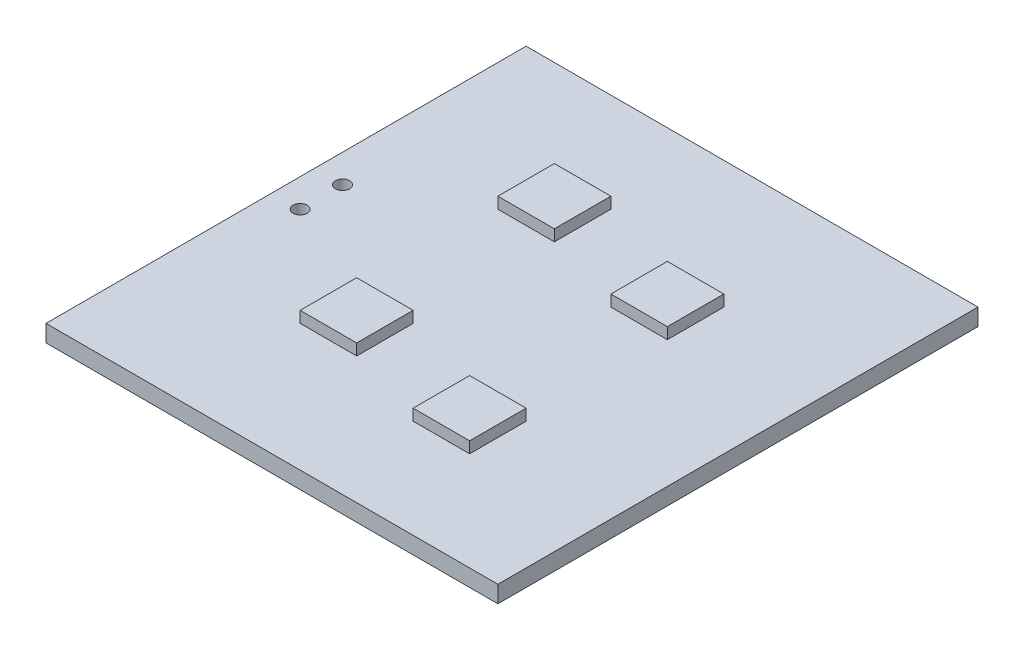
ISO-10303-21;
HEADER;
FILE_DESCRIPTION(('STEP AP214'),'2;1');
FILE_NAME('part.step','',(''),(''),'','','');
FILE_SCHEMA(('AUTOMOTIVE_DESIGN { 1 0 10303 214 1 1 1 1 }'));
ENDSEC;
DATA;
#1=APPLICATION_CONTEXT('core data for automotive mechanical design processes');
#2=APPLICATION_PROTOCOL_DEFINITION('international standard','automotive_design',2000,#1);
#3=PRODUCT_CONTEXT('',#1,'mechanical');
#4=PRODUCT('Part','Part','',(#3));
#5=PRODUCT_RELATED_PRODUCT_CATEGORY('part','',(#4));
#6=PRODUCT_DEFINITION_FORMATION('','',#4);
#7=PRODUCT_DEFINITION_CONTEXT('part definition',#1,'design');
#8=PRODUCT_DEFINITION('design','',#6,#7);
#9=PRODUCT_DEFINITION_SHAPE('','',#8);
#10=(LENGTH_UNIT() NAMED_UNIT(*) SI_UNIT(.MILLI.,.METRE.));
#11=(NAMED_UNIT(*) PLANE_ANGLE_UNIT() SI_UNIT($,.RADIAN.));
#12=(NAMED_UNIT(*) SI_UNIT($,.STERADIAN.) SOLID_ANGLE_UNIT());
#13=UNCERTAINTY_MEASURE_WITH_UNIT(LENGTH_MEASURE(1.E-05),#10,'distance_accuracy_value','');
#14=(GEOMETRIC_REPRESENTATION_CONTEXT(3) GLOBAL_UNCERTAINTY_ASSIGNED_CONTEXT((#13)) GLOBAL_UNIT_ASSIGNED_CONTEXT((#10,
#11,#12)) REPRESENTATION_CONTEXT('',''));
#15=CARTESIAN_POINT('',(0.,0.,0.));
#16=DIRECTION('',(0.,0.,1.));
#17=DIRECTION('',(1.,0.,0.));
#18=AXIS2_PLACEMENT_3D('',#15,#16,#17);
#19=CARTESIAN_POINT('',(0.,1.524,0.));
#20=DIRECTION('',(0.,-1.,0.));
#21=DIRECTION('',(0.,0.,-1.));
#22=AXIS2_PLACEMENT_3D('',#19,#20,#21);
#23=PLANE('',#22);
#24=DIRECTION('',(0.,0.,1.));
#25=VECTOR('',#24,1.);
#26=CARTESIAN_POINT('',(11.43,1.524,-16.51));
#27=LINE('',#26,#25);
#28=CARTESIAN_POINT('',(11.43,1.524,-16.51));
#29=VERTEX_POINT('',#28);
#30=CARTESIAN_POINT('',(11.43,1.524,-11.43));
#31=VERTEX_POINT('',#30);
#32=EDGE_CURVE('E193',#29,#31,#27,.T.);
#33=ORIENTED_EDGE('',*,*,#32,.F.);
#34=DIRECTION('',(-1.,0.,0.));
#35=VECTOR('',#34,1.);
#36=CARTESIAN_POINT('',(11.43,1.524,-16.51));
#37=LINE('',#36,#35);
#38=CARTESIAN_POINT('',(16.51,1.524,-16.51));
#39=VERTEX_POINT('',#38);
#40=EDGE_CURVE('E206',#39,#29,#37,.T.);
#41=ORIENTED_EDGE('',*,*,#40,.F.);
#42=DIRECTION('',(0.,0.,-1.));
#43=VECTOR('',#42,1.);
#44=CARTESIAN_POINT('',(16.51,1.524,-16.51));
#45=LINE('',#44,#43);
#46=CARTESIAN_POINT('',(16.51,1.524,-11.43));
#47=VERTEX_POINT('',#46);
#48=EDGE_CURVE('E215',#47,#39,#45,.T.);
#49=ORIENTED_EDGE('',*,*,#48,.F.);
#50=DIRECTION('',(1.,0.,0.));
#51=VECTOR('',#50,1.);
#52=CARTESIAN_POINT('',(11.43,1.524,-11.43));
#53=LINE('',#52,#51);
#54=EDGE_CURVE('E196',#31,#47,#53,.T.);
#55=ORIENTED_EDGE('',*,*,#54,.F.);
#56=EDGE_LOOP('',(#33,#41,#49,#55));
#57=FACE_BOUND('',#56,.T.);
#58=DIRECTION('',(0.,0.,1.));
#59=VECTOR('',#58,1.);
#60=CARTESIAN_POINT('',(11.43,1.524,-34.29));
#61=LINE('',#60,#59);
#62=CARTESIAN_POINT('',(11.43,1.524,-34.29));
#63=VERTEX_POINT('',#62);
#64=CARTESIAN_POINT('',(11.43,1.524,-29.21));
#65=VERTEX_POINT('',#64);
#66=EDGE_CURVE('E264',#63,#65,#61,.T.);
#67=ORIENTED_EDGE('',*,*,#66,.F.);
#68=DIRECTION('',(-1.,0.,0.));
#69=VECTOR('',#68,1.);
#70=CARTESIAN_POINT('',(11.43,1.524,-34.29));
#71=LINE('',#70,#69);
#72=CARTESIAN_POINT('',(16.51,1.524,-34.29));
#73=VERTEX_POINT('',#72);
#74=EDGE_CURVE('E269',#73,#63,#71,.T.);
#75=ORIENTED_EDGE('',*,*,#74,.F.);
#76=DIRECTION('',(0.,0.,-1.));
#77=VECTOR('',#76,1.);
#78=CARTESIAN_POINT('',(16.51,1.524,-34.29));
#79=LINE('',#78,#77);
#80=CARTESIAN_POINT('',(16.51,1.524,-29.21));
#81=VERTEX_POINT('',#80);
#82=EDGE_CURVE('E281',#81,#73,#79,.T.);
#83=ORIENTED_EDGE('',*,*,#82,.F.);
#84=DIRECTION('',(1.,0.,0.));
#85=VECTOR('',#84,1.);
#86=CARTESIAN_POINT('',(11.43,1.524,-29.21));
#87=LINE('',#86,#85);
#88=EDGE_CURVE('E278',#65,#81,#87,.T.);
#89=ORIENTED_EDGE('',*,*,#88,.F.);
#90=EDGE_LOOP('',(#67,#75,#83,#89));
#91=FACE_BOUND('',#90,.T.);
#92=CARTESIAN_POINT('',(2.54,1.524,-24.13));
#93=DIRECTION('',(0.,1.,0.));
#94=DIRECTION('',(0.,0.,1.));
#95=AXIS2_PLACEMENT_3D('',#92,#93,#94);
#96=CIRCLE('',#95,0.634999999999998);
#97=CARTESIAN_POINT('',(2.54,1.524,-23.495));
#98=VERTEX_POINT('',#97);
#99=EDGE_CURVE('E302',#98,#98,#96,.T.);
#100=ORIENTED_EDGE('',*,*,#99,.F.);
#101=EDGE_LOOP('',(#100));
#102=FACE_BOUND('',#101,.T.);
#103=CARTESIAN_POINT('',(2.54,1.524,-20.32));
#104=DIRECTION('',(0.,1.,0.));
#105=DIRECTION('',(0.,0.,1.));
#106=AXIS2_PLACEMENT_3D('',#103,#104,#105);
#107=CIRCLE('',#106,0.634999999999999);
#108=CARTESIAN_POINT('',(2.54,1.524,-19.685));
#109=VERTEX_POINT('',#108);
#110=EDGE_CURVE('E297',#109,#109,#107,.T.);
#111=ORIENTED_EDGE('',*,*,#110,.F.);
#112=EDGE_LOOP('',(#111));
#113=FACE_BOUND('',#112,.T.);
#114=DIRECTION('',(0.,0.,1.));
#115=VECTOR('',#114,1.);
#116=CARTESIAN_POINT('',(0.,1.524,0.));
#117=LINE('',#116,#115);
#118=CARTESIAN_POINT('',(0.,1.524,-43.18));
#119=VERTEX_POINT('',#118);
#120=CARTESIAN_POINT('',(0.,1.524,0.));
#121=VERTEX_POINT('',#120);
#122=EDGE_CURVE('E310',#119,#121,#117,.T.);
#123=ORIENTED_EDGE('',*,*,#122,.T.);
#124=DIRECTION('',(1.,0.,0.));
#125=VECTOR('',#124,1.);
#126=CARTESIAN_POINT('',(0.,1.524,0.));
#127=LINE('',#126,#125);
#128=CARTESIAN_POINT('',(40.64,1.524,0.));
#129=VERTEX_POINT('',#128);
#130=EDGE_CURVE('E313',#121,#129,#127,.T.);
#131=ORIENTED_EDGE('',*,*,#130,.T.);
#132=DIRECTION('',(0.,0.,-1.));
#133=VECTOR('',#132,1.);
#134=CARTESIAN_POINT('',(40.64,1.524,0.));
#135=LINE('',#134,#133);
#136=CARTESIAN_POINT('',(40.64,1.524,-43.18));
#137=VERTEX_POINT('',#136);
#138=EDGE_CURVE('E316',#129,#137,#135,.T.);
#139=ORIENTED_EDGE('',*,*,#138,.T.);
#140=DIRECTION('',(-1.,0.,0.));
#141=VECTOR('',#140,1.);
#142=CARTESIAN_POINT('',(0.,1.524,-43.18));
#143=LINE('',#142,#141);
#144=EDGE_CURVE('E318',#137,#119,#143,.T.);
#145=ORIENTED_EDGE('',*,*,#144,.T.);
#146=EDGE_LOOP('',(#123,#131,#139,#145));
#147=FACE_BOUND('',#146,.T.);
#148=DIRECTION('',(0.,0.,1.));
#149=VECTOR('',#148,1.);
#150=CARTESIAN_POINT('',(24.13,1.524,-31.75));
#151=LINE('',#150,#149);
#152=CARTESIAN_POINT('',(24.13,1.524,-31.75));
#153=VERTEX_POINT('',#152);
#154=CARTESIAN_POINT('',(24.13,1.524,-26.67));
#155=VERTEX_POINT('',#154);
#156=EDGE_CURVE('E231',#153,#155,#151,.T.);
#157=ORIENTED_EDGE('',*,*,#156,.F.);
#158=DIRECTION('',(-1.,0.,0.));
#159=VECTOR('',#158,1.);
#160=CARTESIAN_POINT('',(24.13,1.524,-31.75));
#161=LINE('',#160,#159);
#162=CARTESIAN_POINT('',(29.21,1.524,-31.75));
#163=VERTEX_POINT('',#162);
#164=EDGE_CURVE('E236',#163,#153,#161,.T.);
#165=ORIENTED_EDGE('',*,*,#164,.F.);
#166=DIRECTION('',(0.,0.,-1.));
#167=VECTOR('',#166,1.);
#168=CARTESIAN_POINT('',(29.21,1.524,-31.75));
#169=LINE('',#168,#167);
#170=CARTESIAN_POINT('',(29.21,1.524,-26.67));
#171=VERTEX_POINT('',#170);
#172=EDGE_CURVE('E248',#171,#163,#169,.T.);
#173=ORIENTED_EDGE('',*,*,#172,.F.);
#174=DIRECTION('',(1.,0.,0.));
#175=VECTOR('',#174,1.);
#176=CARTESIAN_POINT('',(24.13,1.524,-26.67));
#177=LINE('',#176,#175);
#178=EDGE_CURVE('E245',#155,#171,#177,.T.);
#179=ORIENTED_EDGE('',*,*,#178,.F.);
#180=EDGE_LOOP('',(#157,#165,#173,#179));
#181=FACE_BOUND('',#180,.T.);
#182=DIRECTION('',(0.,0.,1.));
#183=VECTOR('',#182,1.);
#184=CARTESIAN_POINT('',(24.13,1.524,-13.97));
#185=LINE('',#184,#183);
#186=CARTESIAN_POINT('',(24.13,1.524,-13.97));
#187=VERTEX_POINT('',#186);
#188=CARTESIAN_POINT('',(24.13,1.524,-8.89));
#189=VERTEX_POINT('',#188);
#190=EDGE_CURVE('E192',#187,#189,#185,.T.);
#191=ORIENTED_EDGE('',*,*,#190,.F.);
#192=DIRECTION('',(-1.,0.,0.));
#193=VECTOR('',#192,1.);
#194=CARTESIAN_POINT('',(24.13,1.524,-13.97));
#195=LINE('',#194,#193);
#196=CARTESIAN_POINT('',(29.21,1.524,-13.97));
#197=VERTEX_POINT('',#196);
#198=EDGE_CURVE('E189',#197,#187,#195,.T.);
#199=ORIENTED_EDGE('',*,*,#198,.F.);
#200=DIRECTION('',(0.,0.,-1.));
#201=VECTOR('',#200,1.);
#202=CARTESIAN_POINT('',(29.21,1.524,-13.97));
#203=LINE('',#202,#201);
#204=CARTESIAN_POINT('',(29.21,1.524,-8.89));
#205=VERTEX_POINT('',#204);
#206=EDGE_CURVE('E55',#205,#197,#203,.T.);
#207=ORIENTED_EDGE('',*,*,#206,.F.);
#208=DIRECTION('',(1.,0.,0.));
#209=VECTOR('',#208,1.);
#210=CARTESIAN_POINT('',(24.13,1.524,-8.89));
#211=LINE('',#210,#209);
#212=EDGE_CURVE('E50',#189,#205,#211,.T.);
#213=ORIENTED_EDGE('',*,*,#212,.F.);
#214=EDGE_LOOP('',(#191,#199,#207,#213));
#215=FACE_BOUND('',#214,.T.);
#216=ADVANCED_FACE('F35',(#57,#91,#102,#113,#147,#181,#215),#23,.F.);
#217=CARTESIAN_POINT('',(0.,1.524,0.));
#218=DIRECTION('',(1.,0.,0.));
#219=DIRECTION('',(0.,0.,-1.));
#220=AXIS2_PLACEMENT_3D('',#217,#218,#219);
#221=PLANE('',#220);
#222=DIRECTION('',(0.,0.,1.));
#223=VECTOR('',#222,1.);
#224=CARTESIAN_POINT('',(0.,0.,0.));
#225=LINE('',#224,#223);
#226=CARTESIAN_POINT('',(0.,0.,-43.18));
#227=VERTEX_POINT('',#226);
#228=CARTESIAN_POINT('',(0.,0.,0.));
#229=VERTEX_POINT('',#228);
#230=EDGE_CURVE('E301',#227,#229,#225,.T.);
#231=ORIENTED_EDGE('',*,*,#230,.T.);
#232=DIRECTION('',(0.,-1.,0.));
#233=VECTOR('',#232,1.);
#234=CARTESIAN_POINT('',(0.,1.524,0.));
#235=LINE('',#234,#233);
#236=EDGE_CURVE('E11',#121,#229,#235,.T.);
#237=ORIENTED_EDGE('',*,*,#236,.F.);
#238=ORIENTED_EDGE('',*,*,#122,.F.);
#239=DIRECTION('',(0.,-1.,0.));
#240=VECTOR('',#239,1.);
#241=CARTESIAN_POINT('',(0.,1.524,-43.18));
#242=LINE('',#241,#240);
#243=EDGE_CURVE('E320',#119,#227,#242,.T.);
#244=ORIENTED_EDGE('',*,*,#243,.T.);
#245=EDGE_LOOP('',(#231,#237,#238,#244));
#246=FACE_BOUND('',#245,.T.);
#247=ADVANCED_FACE('F37',(#246),#221,.F.);
#248=CARTESIAN_POINT('',(0.,1.524,0.));
#249=DIRECTION('',(0.,0.,-1.));
#250=DIRECTION('',(-1.,0.,0.));
#251=AXIS2_PLACEMENT_3D('',#248,#249,#250);
#252=PLANE('',#251);
#253=DIRECTION('',(1.,0.,0.));
#254=VECTOR('',#253,1.);
#255=CARTESIAN_POINT('',(0.,0.,0.));
#256=LINE('',#255,#254);
#257=CARTESIAN_POINT('',(40.64,0.,0.));
#258=VERTEX_POINT('',#257);
#259=EDGE_CURVE('E323',#229,#258,#256,.T.);
#260=ORIENTED_EDGE('',*,*,#259,.T.);
#261=DIRECTION('',(0.,-1.,0.));
#262=VECTOR('',#261,1.);
#263=CARTESIAN_POINT('',(40.64,1.524,0.));
#264=LINE('',#263,#262);
#265=EDGE_CURVE('E43',#129,#258,#264,.T.);
#266=ORIENTED_EDGE('',*,*,#265,.F.);
#267=ORIENTED_EDGE('',*,*,#130,.F.);
#268=ORIENTED_EDGE('',*,*,#236,.T.);
#269=EDGE_LOOP('',(#260,#266,#267,#268));
#270=FACE_BOUND('',#269,.T.);
#271=ADVANCED_FACE('F353',(#270),#252,.F.);
#272=CARTESIAN_POINT('',(40.64,1.524,0.));
#273=DIRECTION('',(-1.,0.,0.));
#274=DIRECTION('',(0.,0.,1.));
#275=AXIS2_PLACEMENT_3D('',#272,#273,#274);
#276=PLANE('',#275);
#277=DIRECTION('',(0.,0.,-1.));
#278=VECTOR('',#277,1.);
#279=CARTESIAN_POINT('',(40.64,0.,0.));
#280=LINE('',#279,#278);
#281=CARTESIAN_POINT('',(40.64,0.,-43.18));
#282=VERTEX_POINT('',#281);
#283=EDGE_CURVE('E325',#258,#282,#280,.T.);
#284=ORIENTED_EDGE('',*,*,#283,.T.);
#285=DIRECTION('',(0.,-1.,0.));
#286=VECTOR('',#285,1.);
#287=CARTESIAN_POINT('',(40.64,1.524,-43.18));
#288=LINE('',#287,#286);
#289=EDGE_CURVE('E330',#137,#282,#288,.T.);
#290=ORIENTED_EDGE('',*,*,#289,.F.);
#291=ORIENTED_EDGE('',*,*,#138,.F.);
#292=ORIENTED_EDGE('',*,*,#265,.T.);
#293=EDGE_LOOP('',(#284,#290,#291,#292));
#294=FACE_BOUND('',#293,.T.);
#295=ADVANCED_FACE('F337',(#294),#276,.F.);
#296=CARTESIAN_POINT('',(0.,1.524,-43.18));
#297=DIRECTION('',(0.,0.,1.));
#298=DIRECTION('',(1.,0.,0.));
#299=AXIS2_PLACEMENT_3D('',#296,#297,#298);
#300=PLANE('',#299);
#301=DIRECTION('',(-1.,0.,0.));
#302=VECTOR('',#301,1.);
#303=CARTESIAN_POINT('',(0.,0.,-43.18));
#304=LINE('',#303,#302);
#305=EDGE_CURVE('E314',#282,#227,#304,.T.);
#306=ORIENTED_EDGE('',*,*,#305,.T.);
#307=ORIENTED_EDGE('',*,*,#243,.F.);
#308=ORIENTED_EDGE('',*,*,#144,.F.);
#309=ORIENTED_EDGE('',*,*,#289,.T.);
#310=EDGE_LOOP('',(#306,#307,#308,#309));
#311=FACE_BOUND('',#310,.T.);
#312=ADVANCED_FACE('F346',(#311),#300,.F.);
#313=CARTESIAN_POINT('',(0.,0.,0.));
#314=DIRECTION('',(0.,-1.,0.));
#315=DIRECTION('',(0.,0.,-1.));
#316=AXIS2_PLACEMENT_3D('',#313,#314,#315);
#317=PLANE('',#316);
#318=CARTESIAN_POINT('',(2.54,0.,-24.13));
#319=DIRECTION('',(0.,1.,0.));
#320=DIRECTION('',(0.,0.,1.));
#321=AXIS2_PLACEMENT_3D('',#318,#319,#320);
#322=CIRCLE('',#321,0.634999999999998);
#323=CARTESIAN_POINT('',(2.54,0.,-23.495));
#324=VERTEX_POINT('',#323);
#325=EDGE_CURVE('E298',#324,#324,#322,.T.);
#326=ORIENTED_EDGE('',*,*,#325,.T.);
#327=EDGE_LOOP('',(#326));
#328=FACE_BOUND('',#327,.T.);
#329=CARTESIAN_POINT('',(2.54,0.,-20.32));
#330=DIRECTION('',(0.,1.,0.));
#331=DIRECTION('',(0.,0.,1.));
#332=AXIS2_PLACEMENT_3D('',#329,#330,#331);
#333=CIRCLE('',#332,0.634999999999999);
#334=CARTESIAN_POINT('',(2.54,0.,-19.685));
#335=VERTEX_POINT('',#334);
#336=EDGE_CURVE('E305',#335,#335,#333,.T.);
#337=ORIENTED_EDGE('',*,*,#336,.T.);
#338=EDGE_LOOP('',(#337));
#339=FACE_BOUND('',#338,.T.);
#340=ORIENTED_EDGE('',*,*,#230,.F.);
#341=ORIENTED_EDGE('',*,*,#305,.F.);
#342=ORIENTED_EDGE('',*,*,#283,.F.);
#343=ORIENTED_EDGE('',*,*,#259,.F.);
#344=EDGE_LOOP('',(#340,#341,#342,#343));
#345=FACE_BOUND('',#344,.T.);
#346=ADVANCED_FACE('F343',(#328,#339,#345),#317,.T.);
#347=CARTESIAN_POINT('',(2.54,0.,-20.32));
#348=DIRECTION('',(0.,1.,0.));
#349=DIRECTION('',(0.,0.,1.));
#350=AXIS2_PLACEMENT_3D('',#347,#348,#349);
#351=CYLINDRICAL_SURFACE('',#350,0.634999999999999);
#352=ORIENTED_EDGE('',*,*,#336,.F.);
#353=EDGE_LOOP('',(#352));
#354=FACE_BOUND('',#353,.T.);
#355=ORIENTED_EDGE('',*,*,#110,.T.);
#356=EDGE_LOOP('',(#355));
#357=FACE_BOUND('',#356,.T.);
#358=ADVANCED_FACE('F368',(#354,#357),#351,.F.);
#359=CARTESIAN_POINT('',(2.54,0.,-24.13));
#360=DIRECTION('',(0.,1.,0.));
#361=DIRECTION('',(0.,0.,1.));
#362=AXIS2_PLACEMENT_3D('',#359,#360,#361);
#363=CYLINDRICAL_SURFACE('',#362,0.634999999999998);
#364=ORIENTED_EDGE('',*,*,#325,.F.);
#365=EDGE_LOOP('',(#364));
#366=FACE_BOUND('',#365,.T.);
#367=ORIENTED_EDGE('',*,*,#99,.T.);
#368=EDGE_LOOP('',(#367));
#369=FACE_BOUND('',#368,.T.);
#370=ADVANCED_FACE('F390',(#366,#369),#363,.F.);
#371=CARTESIAN_POINT('',(11.43,2.54,-34.29));
#372=DIRECTION('',(1.,0.,0.));
#373=DIRECTION('',(0.,0.,-1.));
#374=AXIS2_PLACEMENT_3D('',#371,#372,#373);
#375=PLANE('',#374);
#376=ORIENTED_EDGE('',*,*,#66,.T.);
#377=DIRECTION('',(0.,-1.,0.));
#378=VECTOR('',#377,1.);
#379=CARTESIAN_POINT('',(11.43,2.54,-29.21));
#380=LINE('',#379,#378);
#381=CARTESIAN_POINT('',(11.43,2.54,-29.21));
#382=VERTEX_POINT('',#381);
#383=EDGE_CURVE('E294',#382,#65,#380,.T.);
#384=ORIENTED_EDGE('',*,*,#383,.F.);
#385=DIRECTION('',(0.,0.,1.));
#386=VECTOR('',#385,1.);
#387=CARTESIAN_POINT('',(11.43,2.54,-34.29));
#388=LINE('',#387,#386);
#389=CARTESIAN_POINT('',(11.43,2.54,-34.29));
#390=VERTEX_POINT('',#389);
#391=EDGE_CURVE('E265',#390,#382,#388,.T.);
#392=ORIENTED_EDGE('',*,*,#391,.F.);
#393=DIRECTION('',(0.,-1.,0.));
#394=VECTOR('',#393,1.);
#395=CARTESIAN_POINT('',(11.43,2.54,-34.29));
#396=LINE('',#395,#394);
#397=EDGE_CURVE('E275',#390,#63,#396,.T.);
#398=ORIENTED_EDGE('',*,*,#397,.T.);
#399=EDGE_LOOP('',(#376,#384,#392,#398));
#400=FACE_BOUND('',#399,.T.);
#401=ADVANCED_FACE('F397',(#400),#375,.F.);
#402=CARTESIAN_POINT('',(11.43,2.54,-29.21));
#403=DIRECTION('',(0.,0.,-1.));
#404=DIRECTION('',(-1.,0.,0.));
#405=AXIS2_PLACEMENT_3D('',#402,#403,#404);
#406=PLANE('',#405);
#407=ORIENTED_EDGE('',*,*,#88,.T.);
#408=DIRECTION('',(0.,-1.,0.));
#409=VECTOR('',#408,1.);
#410=CARTESIAN_POINT('',(16.51,2.54,-29.21));
#411=LINE('',#410,#409);
#412=CARTESIAN_POINT('',(16.51,2.54,-29.21));
#413=VERTEX_POINT('',#412);
#414=EDGE_CURVE('E291',#413,#81,#411,.T.);
#415=ORIENTED_EDGE('',*,*,#414,.F.);
#416=DIRECTION('',(1.,0.,0.));
#417=VECTOR('',#416,1.);
#418=CARTESIAN_POINT('',(11.43,2.54,-29.21));
#419=LINE('',#418,#417);
#420=EDGE_CURVE('E268',#382,#413,#419,.T.);
#421=ORIENTED_EDGE('',*,*,#420,.F.);
#422=ORIENTED_EDGE('',*,*,#383,.T.);
#423=EDGE_LOOP('',(#407,#415,#421,#422));
#424=FACE_BOUND('',#423,.T.);
#425=ADVANCED_FACE('F404',(#424),#406,.F.);
#426=CARTESIAN_POINT('',(16.51,2.54,-34.29));
#427=DIRECTION('',(-1.,0.,0.));
#428=DIRECTION('',(0.,0.,1.));
#429=AXIS2_PLACEMENT_3D('',#426,#427,#428);
#430=PLANE('',#429);
#431=ORIENTED_EDGE('',*,*,#82,.T.);
#432=DIRECTION('',(0.,-1.,0.));
#433=VECTOR('',#432,1.);
#434=CARTESIAN_POINT('',(16.51,2.54,-34.29));
#435=LINE('',#434,#433);
#436=CARTESIAN_POINT('',(16.51,2.54,-34.29));
#437=VERTEX_POINT('',#436);
#438=EDGE_CURVE('E288',#437,#73,#435,.T.);
#439=ORIENTED_EDGE('',*,*,#438,.F.);
#440=DIRECTION('',(0.,0.,-1.));
#441=VECTOR('',#440,1.);
#442=CARTESIAN_POINT('',(16.51,2.54,-34.29));
#443=LINE('',#442,#441);
#444=EDGE_CURVE('E271',#413,#437,#443,.T.);
#445=ORIENTED_EDGE('',*,*,#444,.F.);
#446=ORIENTED_EDGE('',*,*,#414,.T.);
#447=EDGE_LOOP('',(#431,#439,#445,#446));
#448=FACE_BOUND('',#447,.T.);
#449=ADVANCED_FACE('F414',(#448),#430,.F.);
#450=CARTESIAN_POINT('',(11.43,2.54,-34.29));
#451=DIRECTION('',(0.,0.,1.));
#452=DIRECTION('',(1.,0.,0.));
#453=AXIS2_PLACEMENT_3D('',#450,#451,#452);
#454=PLANE('',#453);
#455=ORIENTED_EDGE('',*,*,#74,.T.);
#456=ORIENTED_EDGE('',*,*,#397,.F.);
#457=DIRECTION('',(-1.,0.,0.));
#458=VECTOR('',#457,1.);
#459=CARTESIAN_POINT('',(11.43,2.54,-34.29));
#460=LINE('',#459,#458);
#461=EDGE_CURVE('E273',#437,#390,#460,.T.);
#462=ORIENTED_EDGE('',*,*,#461,.F.);
#463=ORIENTED_EDGE('',*,*,#438,.T.);
#464=EDGE_LOOP('',(#455,#456,#462,#463));
#465=FACE_BOUND('',#464,.T.);
#466=ADVANCED_FACE('F423',(#465),#454,.F.);
#467=CARTESIAN_POINT('',(0.,2.54,0.));
#468=DIRECTION('',(0.,1.,0.));
#469=DIRECTION('',(0.,0.,1.));
#470=AXIS2_PLACEMENT_3D('',#467,#468,#469);
#471=PLANE('',#470);
#472=ORIENTED_EDGE('',*,*,#391,.T.);
#473=ORIENTED_EDGE('',*,*,#420,.T.);
#474=ORIENTED_EDGE('',*,*,#444,.T.);
#475=ORIENTED_EDGE('',*,*,#461,.T.);
#476=EDGE_LOOP('',(#472,#473,#474,#475));
#477=FACE_BOUND('',#476,.T.);
#478=ADVANCED_FACE('F431',(#477),#471,.T.);
#479=CARTESIAN_POINT('',(24.13,2.54,-31.75));
#480=DIRECTION('',(1.,0.,0.));
#481=DIRECTION('',(0.,0.,-1.));
#482=AXIS2_PLACEMENT_3D('',#479,#480,#481);
#483=PLANE('',#482);
#484=ORIENTED_EDGE('',*,*,#156,.T.);
#485=DIRECTION('',(0.,-1.,0.));
#486=VECTOR('',#485,1.);
#487=CARTESIAN_POINT('',(24.13,2.54,-26.67));
#488=LINE('',#487,#486);
#489=CARTESIAN_POINT('',(24.13,2.54,-26.67));
#490=VERTEX_POINT('',#489);
#491=EDGE_CURVE('E261',#490,#155,#488,.T.);
#492=ORIENTED_EDGE('',*,*,#491,.F.);
#493=DIRECTION('',(0.,0.,1.));
#494=VECTOR('',#493,1.);
#495=CARTESIAN_POINT('',(24.13,2.54,-31.75));
#496=LINE('',#495,#494);
#497=CARTESIAN_POINT('',(24.13,2.54,-31.75));
#498=VERTEX_POINT('',#497);
#499=EDGE_CURVE('E232',#498,#490,#496,.T.);
#500=ORIENTED_EDGE('',*,*,#499,.F.);
#501=DIRECTION('',(0.,-1.,0.));
#502=VECTOR('',#501,1.);
#503=CARTESIAN_POINT('',(24.13,2.54,-31.75));
#504=LINE('',#503,#502);
#505=EDGE_CURVE('E242',#498,#153,#504,.T.);
#506=ORIENTED_EDGE('',*,*,#505,.T.);
#507=EDGE_LOOP('',(#484,#492,#500,#506));
#508=FACE_BOUND('',#507,.T.);
#509=ADVANCED_FACE('F438',(#508),#483,.F.);
#510=CARTESIAN_POINT('',(24.13,2.54,-26.67));
#511=DIRECTION('',(0.,0.,-1.));
#512=DIRECTION('',(-1.,0.,0.));
#513=AXIS2_PLACEMENT_3D('',#510,#511,#512);
#514=PLANE('',#513);
#515=ORIENTED_EDGE('',*,*,#178,.T.);
#516=DIRECTION('',(0.,-1.,0.));
#517=VECTOR('',#516,1.);
#518=CARTESIAN_POINT('',(29.21,2.54,-26.67));
#519=LINE('',#518,#517);
#520=CARTESIAN_POINT('',(29.21,2.54,-26.67));
#521=VERTEX_POINT('',#520);
#522=EDGE_CURVE('E258',#521,#171,#519,.T.);
#523=ORIENTED_EDGE('',*,*,#522,.F.);
#524=DIRECTION('',(1.,0.,0.));
#525=VECTOR('',#524,1.);
#526=CARTESIAN_POINT('',(24.13,2.54,-26.67));
#527=LINE('',#526,#525);
#528=EDGE_CURVE('E235',#490,#521,#527,.T.);
#529=ORIENTED_EDGE('',*,*,#528,.F.);
#530=ORIENTED_EDGE('',*,*,#491,.T.);
#531=EDGE_LOOP('',(#515,#523,#529,#530));
#532=FACE_BOUND('',#531,.T.);
#533=ADVANCED_FACE('F446',(#532),#514,.F.);
#534=CARTESIAN_POINT('',(29.21,2.54,-31.75));
#535=DIRECTION('',(-1.,0.,0.));
#536=DIRECTION('',(0.,0.,1.));
#537=AXIS2_PLACEMENT_3D('',#534,#535,#536);
#538=PLANE('',#537);
#539=ORIENTED_EDGE('',*,*,#172,.T.);
#540=DIRECTION('',(0.,-1.,0.));
#541=VECTOR('',#540,1.);
#542=CARTESIAN_POINT('',(29.21,2.54,-31.75));
#543=LINE('',#542,#541);
#544=CARTESIAN_POINT('',(29.21,2.54,-31.75));
#545=VERTEX_POINT('',#544);
#546=EDGE_CURVE('E255',#545,#163,#543,.T.);
#547=ORIENTED_EDGE('',*,*,#546,.F.);
#548=DIRECTION('',(0.,0.,-1.));
#549=VECTOR('',#548,1.);
#550=CARTESIAN_POINT('',(29.21,2.54,-31.75));
#551=LINE('',#550,#549);
#552=EDGE_CURVE('E238',#521,#545,#551,.T.);
#553=ORIENTED_EDGE('',*,*,#552,.F.);
#554=ORIENTED_EDGE('',*,*,#522,.T.);
#555=EDGE_LOOP('',(#539,#547,#553,#554));
#556=FACE_BOUND('',#555,.T.);
#557=ADVANCED_FACE('F454',(#556),#538,.F.);
#558=CARTESIAN_POINT('',(24.13,2.54,-31.75));
#559=DIRECTION('',(0.,0.,1.));
#560=DIRECTION('',(1.,0.,0.));
#561=AXIS2_PLACEMENT_3D('',#558,#559,#560);
#562=PLANE('',#561);
#563=ORIENTED_EDGE('',*,*,#164,.T.);
#564=ORIENTED_EDGE('',*,*,#505,.F.);
#565=DIRECTION('',(-1.,0.,0.));
#566=VECTOR('',#565,1.);
#567=CARTESIAN_POINT('',(24.13,2.54,-31.75));
#568=LINE('',#567,#566);
#569=EDGE_CURVE('E240',#545,#498,#568,.T.);
#570=ORIENTED_EDGE('',*,*,#569,.F.);
#571=ORIENTED_EDGE('',*,*,#546,.T.);
#572=EDGE_LOOP('',(#563,#564,#570,#571));
#573=FACE_BOUND('',#572,.T.);
#574=ADVANCED_FACE('F463',(#573),#562,.F.);
#575=CARTESIAN_POINT('',(0.,2.54,0.));
#576=DIRECTION('',(0.,1.,0.));
#577=DIRECTION('',(0.,0.,1.));
#578=AXIS2_PLACEMENT_3D('',#575,#576,#577);
#579=PLANE('',#578);
#580=ORIENTED_EDGE('',*,*,#499,.T.);
#581=ORIENTED_EDGE('',*,*,#528,.T.);
#582=ORIENTED_EDGE('',*,*,#552,.T.);
#583=ORIENTED_EDGE('',*,*,#569,.T.);
#584=EDGE_LOOP('',(#580,#581,#582,#583));
#585=FACE_BOUND('',#584,.T.);
#586=ADVANCED_FACE('F471',(#585),#579,.T.);
#587=CARTESIAN_POINT('',(11.43,2.54,-16.51));
#588=DIRECTION('',(1.,0.,0.));
#589=DIRECTION('',(0.,0.,-1.));
#590=AXIS2_PLACEMENT_3D('',#587,#588,#589);
#591=PLANE('',#590);
#592=ORIENTED_EDGE('',*,*,#32,.T.);
#593=DIRECTION('',(0.,-1.,0.));
#594=VECTOR('',#593,1.);
#595=CARTESIAN_POINT('',(11.43,2.54,-11.43));
#596=LINE('',#595,#594);
#597=CARTESIAN_POINT('',(11.43,2.54,-11.43));
#598=VERTEX_POINT('',#597);
#599=EDGE_CURVE('E228',#598,#31,#596,.T.);
#600=ORIENTED_EDGE('',*,*,#599,.F.);
#601=DIRECTION('',(0.,0.,1.));
#602=VECTOR('',#601,1.);
#603=CARTESIAN_POINT('',(11.43,2.54,-16.51));
#604=LINE('',#603,#602);
#605=CARTESIAN_POINT('',(11.43,2.54,-16.51));
#606=VERTEX_POINT('',#605);
#607=EDGE_CURVE('E202',#606,#598,#604,.T.);
#608=ORIENTED_EDGE('',*,*,#607,.F.);
#609=DIRECTION('',(0.,-1.,0.));
#610=VECTOR('',#609,1.);
#611=CARTESIAN_POINT('',(11.43,2.54,-16.51));
#612=LINE('',#611,#610);
#613=EDGE_CURVE('E211',#606,#29,#612,.T.);
#614=ORIENTED_EDGE('',*,*,#613,.T.);
#615=EDGE_LOOP('',(#592,#600,#608,#614));
#616=FACE_BOUND('',#615,.T.);
#617=ADVANCED_FACE('F478',(#616),#591,.F.);
#618=CARTESIAN_POINT('',(11.43,2.54,-11.43));
#619=DIRECTION('',(0.,0.,-1.));
#620=DIRECTION('',(-1.,0.,0.));
#621=AXIS2_PLACEMENT_3D('',#618,#619,#620);
#622=PLANE('',#621);
#623=ORIENTED_EDGE('',*,*,#54,.T.);
#624=DIRECTION('',(0.,-1.,0.));
#625=VECTOR('',#624,1.);
#626=CARTESIAN_POINT('',(16.51,2.54,-11.43));
#627=LINE('',#626,#625);
#628=CARTESIAN_POINT('',(16.51,2.54,-11.43));
#629=VERTEX_POINT('',#628);
#630=EDGE_CURVE('E225',#629,#47,#627,.T.);
#631=ORIENTED_EDGE('',*,*,#630,.F.);
#632=DIRECTION('',(1.,0.,0.));
#633=VECTOR('',#632,1.);
#634=CARTESIAN_POINT('',(11.43,2.54,-11.43));
#635=LINE('',#634,#633);
#636=EDGE_CURVE('E205',#598,#629,#635,.T.);
#637=ORIENTED_EDGE('',*,*,#636,.F.);
#638=ORIENTED_EDGE('',*,*,#599,.T.);
#639=EDGE_LOOP('',(#623,#631,#637,#638));
#640=FACE_BOUND('',#639,.T.);
#641=ADVANCED_FACE('F486',(#640),#622,.F.);
#642=CARTESIAN_POINT('',(16.51,2.54,-16.51));
#643=DIRECTION('',(-1.,0.,0.));
#644=DIRECTION('',(0.,0.,1.));
#645=AXIS2_PLACEMENT_3D('',#642,#643,#644);
#646=PLANE('',#645);
#647=ORIENTED_EDGE('',*,*,#48,.T.);
#648=DIRECTION('',(0.,-1.,0.));
#649=VECTOR('',#648,1.);
#650=CARTESIAN_POINT('',(16.51,2.54,-16.51));
#651=LINE('',#650,#649);
#652=CARTESIAN_POINT('',(16.51,2.54,-16.51));
#653=VERTEX_POINT('',#652);
#654=EDGE_CURVE('E222',#653,#39,#651,.T.);
#655=ORIENTED_EDGE('',*,*,#654,.F.);
#656=DIRECTION('',(0.,0.,-1.));
#657=VECTOR('',#656,1.);
#658=CARTESIAN_POINT('',(16.51,2.54,-16.51));
#659=LINE('',#658,#657);
#660=EDGE_CURVE('E208',#629,#653,#659,.T.);
#661=ORIENTED_EDGE('',*,*,#660,.F.);
#662=ORIENTED_EDGE('',*,*,#630,.T.);
#663=EDGE_LOOP('',(#647,#655,#661,#662));
#664=FACE_BOUND('',#663,.T.);
#665=ADVANCED_FACE('F495',(#664),#646,.F.);
#666=CARTESIAN_POINT('',(11.43,2.54,-16.51));
#667=DIRECTION('',(0.,0.,1.));
#668=DIRECTION('',(1.,0.,0.));
#669=AXIS2_PLACEMENT_3D('',#666,#667,#668);
#670=PLANE('',#669);
#671=ORIENTED_EDGE('',*,*,#40,.T.);
#672=ORIENTED_EDGE('',*,*,#613,.F.);
#673=DIRECTION('',(-1.,0.,0.));
#674=VECTOR('',#673,1.);
#675=CARTESIAN_POINT('',(11.43,2.54,-16.51));
#676=LINE('',#675,#674);
#677=EDGE_CURVE('E210',#653,#606,#676,.T.);
#678=ORIENTED_EDGE('',*,*,#677,.F.);
#679=ORIENTED_EDGE('',*,*,#654,.T.);
#680=EDGE_LOOP('',(#671,#672,#678,#679));
#681=FACE_BOUND('',#680,.T.);
#682=ADVANCED_FACE('F503',(#681),#670,.F.);
#683=CARTESIAN_POINT('',(0.,2.54,0.));
#684=DIRECTION('',(0.,1.,0.));
#685=DIRECTION('',(0.,0.,1.));
#686=AXIS2_PLACEMENT_3D('',#683,#684,#685);
#687=PLANE('',#686);
#688=ORIENTED_EDGE('',*,*,#607,.T.);
#689=ORIENTED_EDGE('',*,*,#636,.T.);
#690=ORIENTED_EDGE('',*,*,#660,.T.);
#691=ORIENTED_EDGE('',*,*,#677,.T.);
#692=EDGE_LOOP('',(#688,#689,#690,#691));
#693=FACE_BOUND('',#692,.T.);
#694=ADVANCED_FACE('F510',(#693),#687,.T.);
#695=CARTESIAN_POINT('',(24.13,2.54,-13.97));
#696=DIRECTION('',(1.,0.,0.));
#697=DIRECTION('',(0.,0.,-1.));
#698=AXIS2_PLACEMENT_3D('',#695,#696,#697);
#699=PLANE('',#698);
#700=ORIENTED_EDGE('',*,*,#190,.T.);
#701=DIRECTION('',(0.,-1.,0.));
#702=VECTOR('',#701,1.);
#703=CARTESIAN_POINT('',(24.13,2.54,-8.89));
#704=LINE('',#703,#702);
#705=CARTESIAN_POINT('',(24.13,2.54,-8.89));
#706=VERTEX_POINT('',#705);
#707=EDGE_CURVE('E173',#706,#189,#704,.T.);
#708=ORIENTED_EDGE('',*,*,#707,.F.);
#709=DIRECTION('',(0.,0.,1.));
#710=VECTOR('',#709,1.);
#711=CARTESIAN_POINT('',(24.13,2.54,-13.97));
#712=LINE('',#711,#710);
#713=CARTESIAN_POINT('',(24.13,2.54,-13.97));
#714=VERTEX_POINT('',#713);
#715=EDGE_CURVE('E180',#714,#706,#712,.T.);
#716=ORIENTED_EDGE('',*,*,#715,.F.);
#717=DIRECTION('',(0.,-1.,0.));
#718=VECTOR('',#717,1.);
#719=CARTESIAN_POINT('',(24.13,2.54,-13.97));
#720=LINE('',#719,#718);
#721=EDGE_CURVE('E675',#714,#187,#720,.T.);
#722=ORIENTED_EDGE('',*,*,#721,.T.);
#723=EDGE_LOOP('',(#700,#708,#716,#722));
#724=FACE_BOUND('',#723,.T.);
#725=ADVANCED_FACE('F191',(#724),#699,.F.);
#726=CARTESIAN_POINT('',(24.13,2.54,-8.89));
#727=DIRECTION('',(0.,0.,-1.));
#728=DIRECTION('',(-1.,0.,0.));
#729=AXIS2_PLACEMENT_3D('',#726,#727,#728);
#730=PLANE('',#729);
#731=ORIENTED_EDGE('',*,*,#212,.T.);
#732=DIRECTION('',(0.,-1.,0.));
#733=VECTOR('',#732,1.);
#734=CARTESIAN_POINT('',(29.21,2.54,-8.89));
#735=LINE('',#734,#733);
#736=CARTESIAN_POINT('',(29.21,2.54,-8.89));
#737=VERTEX_POINT('',#736);
#738=EDGE_CURVE('E176',#737,#205,#735,.T.);
#739=ORIENTED_EDGE('',*,*,#738,.F.);
#740=DIRECTION('',(1.,0.,0.));
#741=VECTOR('',#740,1.);
#742=CARTESIAN_POINT('',(24.13,2.54,-8.89));
#743=LINE('',#742,#741);
#744=EDGE_CURVE('E169',#706,#737,#743,.T.);
#745=ORIENTED_EDGE('',*,*,#744,.F.);
#746=ORIENTED_EDGE('',*,*,#707,.T.);
#747=EDGE_LOOP('',(#731,#739,#745,#746));
#748=FACE_BOUND('',#747,.T.);
#749=ADVANCED_FACE('F171',(#748),#730,.F.);
#750=CARTESIAN_POINT('',(29.21,2.54,-13.97));
#751=DIRECTION('',(-1.,0.,0.));
#752=DIRECTION('',(0.,0.,1.));
#753=AXIS2_PLACEMENT_3D('',#750,#751,#752);
#754=PLANE('',#753);
#755=ORIENTED_EDGE('',*,*,#206,.T.);
#756=DIRECTION('',(0.,-1.,0.));
#757=VECTOR('',#756,1.);
#758=CARTESIAN_POINT('',(29.21,2.54,-13.97));
#759=LINE('',#758,#757);
#760=CARTESIAN_POINT('',(29.21,2.54,-13.97));
#761=VERTEX_POINT('',#760);
#762=EDGE_CURVE('E198',#761,#197,#759,.T.);
#763=ORIENTED_EDGE('',*,*,#762,.F.);
#764=DIRECTION('',(0.,0.,-1.));
#765=VECTOR('',#764,1.);
#766=CARTESIAN_POINT('',(29.21,2.54,-13.97));
#767=LINE('',#766,#765);
#768=EDGE_CURVE('E179',#737,#761,#767,.T.);
#769=ORIENTED_EDGE('',*,*,#768,.F.);
#770=ORIENTED_EDGE('',*,*,#738,.T.);
#771=EDGE_LOOP('',(#755,#763,#769,#770));
#772=FACE_BOUND('',#771,.T.);
#773=ADVANCED_FACE('F530',(#772),#754,.F.);
#774=CARTESIAN_POINT('',(24.13,2.54,-13.97));
#775=DIRECTION('',(0.,0.,1.));
#776=DIRECTION('',(1.,0.,0.));
#777=AXIS2_PLACEMENT_3D('',#774,#775,#776);
#778=PLANE('',#777);
#779=ORIENTED_EDGE('',*,*,#198,.T.);
#780=ORIENTED_EDGE('',*,*,#721,.F.);
#781=DIRECTION('',(-1.,0.,0.));
#782=VECTOR('',#781,1.);
#783=CARTESIAN_POINT('',(24.13,2.54,-13.97));
#784=LINE('',#783,#782);
#785=EDGE_CURVE('E185',#761,#714,#784,.T.);
#786=ORIENTED_EDGE('',*,*,#785,.F.);
#787=ORIENTED_EDGE('',*,*,#762,.T.);
#788=EDGE_LOOP('',(#779,#780,#786,#787));
#789=FACE_BOUND('',#788,.T.);
#790=ADVANCED_FACE('F537',(#789),#778,.F.);
#791=CARTESIAN_POINT('',(0.,2.54,0.));
#792=DIRECTION('',(0.,1.,0.));
#793=DIRECTION('',(0.,0.,1.));
#794=AXIS2_PLACEMENT_3D('',#791,#792,#793);
#795=PLANE('',#794);
#796=ORIENTED_EDGE('',*,*,#715,.T.);
#797=ORIENTED_EDGE('',*,*,#744,.T.);
#798=ORIENTED_EDGE('',*,*,#768,.T.);
#799=ORIENTED_EDGE('',*,*,#785,.T.);
#800=EDGE_LOOP('',(#796,#797,#798,#799));
#801=FACE_BOUND('',#800,.T.);
#802=ADVANCED_FACE('F183',(#801),#795,.T.);
#803=CLOSED_SHELL('',(#216,#247,#271,#295,#312,#346,#358,#370,#401,#425,#449,#466,#478,#509,
#533,#557,#574,#586,#617,#641,#665,#682,#694,#725,#749,#773,#790,#802));
#804=MANIFOLD_SOLID_BREP('B2',#803);
#805=ADVANCED_BREP_SHAPE_REPRESENTATION('',(#18,#804),#14);
#806=SHAPE_DEFINITION_REPRESENTATION(#9,#805);
ENDSEC;
END-ISO-10303-21;
